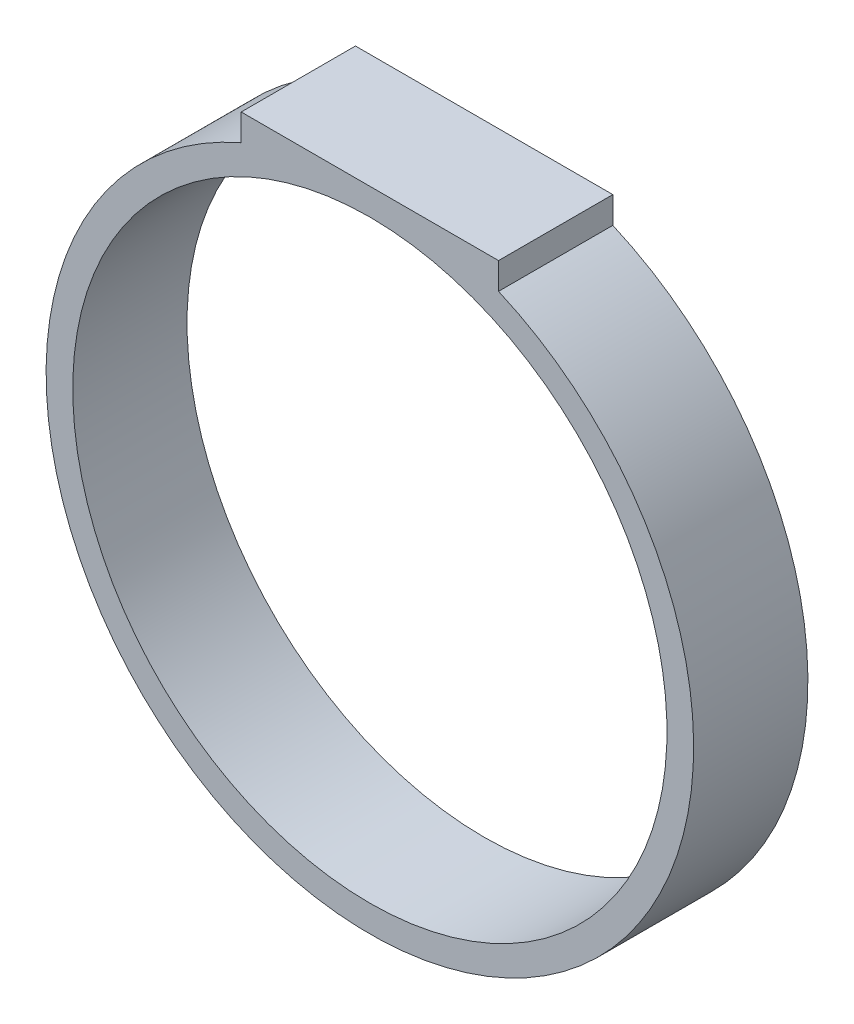
ISO-10303-21;
HEADER;
FILE_DESCRIPTION(('STEP AP214'),'2;1');
FILE_NAME('part.step','',(''),(''),'','','');
FILE_SCHEMA(('AUTOMOTIVE_DESIGN { 1 0 10303 214 1 1 1 1 }'));
ENDSEC;
DATA;
#1=APPLICATION_CONTEXT('core data for automotive mechanical design processes');
#2=APPLICATION_PROTOCOL_DEFINITION('international standard','automotive_design',2000,#1);
#3=PRODUCT_CONTEXT('',#1,'mechanical');
#4=PRODUCT('Part','Part','',(#3));
#5=PRODUCT_RELATED_PRODUCT_CATEGORY('part','',(#4));
#6=PRODUCT_DEFINITION_FORMATION('','',#4);
#7=PRODUCT_DEFINITION_CONTEXT('part definition',#1,'design');
#8=PRODUCT_DEFINITION('design','',#6,#7);
#9=PRODUCT_DEFINITION_SHAPE('','',#8);
#10=(LENGTH_UNIT() NAMED_UNIT(*) SI_UNIT(.MILLI.,.METRE.));
#11=(NAMED_UNIT(*) PLANE_ANGLE_UNIT() SI_UNIT($,.RADIAN.));
#12=(NAMED_UNIT(*) SI_UNIT($,.STERADIAN.) SOLID_ANGLE_UNIT());
#13=UNCERTAINTY_MEASURE_WITH_UNIT(LENGTH_MEASURE(1.E-05),#10,'distance_accuracy_value','');
#14=(GEOMETRIC_REPRESENTATION_CONTEXT(3) GLOBAL_UNCERTAINTY_ASSIGNED_CONTEXT((#13)) GLOBAL_UNIT_ASSIGNED_CONTEXT((#10,
#11,#12)) REPRESENTATION_CONTEXT('',''));
#15=CARTESIAN_POINT('',(0.,0.,0.));
#16=DIRECTION('',(0.,0.,1.));
#17=DIRECTION('',(1.,0.,0.));
#18=AXIS2_PLACEMENT_3D('',#15,#16,#17);
#19=CARTESIAN_POINT('',(0.,0.,15.));
#20=DIRECTION('',(0.,0.,1.));
#21=DIRECTION('',(1.,0.,0.));
#22=AXIS2_PLACEMENT_3D('',#19,#20,#21);
#23=PLANE('',#22);
#24=CARTESIAN_POINT('',(0.,0.,15.));
#25=DIRECTION('',(0.,0.,1.));
#26=DIRECTION('',(1.,0.,0.));
#27=AXIS2_PLACEMENT_3D('',#24,#25,#26);
#28=CIRCLE('',#27,78.);
#29=CARTESIAN_POINT('',(-0.29732137493872,77.9994333312749,15.));
#30=VERTEX_POINT('',#29);
#31=CARTESIAN_POINT('',(0.29732137493872,77.9994333312749,15.));
#32=VERTEX_POINT('',#31);
#33=EDGE_CURVE('E129',#30,#32,#28,.T.);
#34=ORIENTED_EDGE('',*,*,#33,.F.);
#35=DIRECTION('',(1.,0.,0.));
#36=VECTOR('',#35,1.);
#37=CARTESIAN_POINT('',(33.78,77.9994333312749,15.));
#38=LINE('',#37,#36);
#39=EDGE_CURVE('E127',#32,#30,#38,.F.);
#40=ORIENTED_EDGE('',*,*,#39,.F.);
#41=EDGE_LOOP('',(#34,#40));
#42=FACE_BOUND('',#41,.T.);
#43=DIRECTION('',(0.,-1.,0.));
#44=VECTOR('',#43,1.);
#45=CARTESIAN_POINT('',(-33.78,77.9994333312749,15.));
#46=LINE('',#45,#44);
#47=CARTESIAN_POINT('',(-33.78,85.,15.));
#48=VERTEX_POINT('',#47);
#49=CARTESIAN_POINT('',(-33.78,77.9994333312749,15.));
#50=VERTEX_POINT('',#49);
#51=EDGE_CURVE('E109',#48,#50,#46,.T.);
#52=ORIENTED_EDGE('',*,*,#51,.T.);
#53=CARTESIAN_POINT('',(0.,0.,15.));
#54=DIRECTION('',(0.,0.,1.));
#55=DIRECTION('',(1.,0.,0.));
#56=AXIS2_PLACEMENT_3D('',#53,#54,#55);
#57=CIRCLE('',#56,85.);
#58=CARTESIAN_POINT('',(33.78,77.9994333312749,15.));
#59=VERTEX_POINT('',#58);
#60=EDGE_CURVE('E122',#50,#59,#57,.T.);
#61=ORIENTED_EDGE('',*,*,#60,.T.);
#62=DIRECTION('',(0.,1.,0.));
#63=VECTOR('',#62,1.);
#64=CARTESIAN_POINT('',(33.78,77.9994333312749,15.));
#65=LINE('',#64,#63);
#66=CARTESIAN_POINT('',(33.78,85.,15.));
#67=VERTEX_POINT('',#66);
#68=EDGE_CURVE('E115',#59,#67,#65,.T.);
#69=ORIENTED_EDGE('',*,*,#68,.T.);
#70=DIRECTION('',(-1.,0.,0.));
#71=VECTOR('',#70,1.);
#72=CARTESIAN_POINT('',(-33.78,85.,15.));
#73=LINE('',#72,#71);
#74=EDGE_CURVE('E91',#67,#48,#73,.T.);
#75=ORIENTED_EDGE('',*,*,#74,.T.);
#76=EDGE_LOOP('',(#52,#61,#69,#75));
#77=FACE_BOUND('',#76,.T.);
#78=ADVANCED_FACE('F33',(#42,#77),#23,.T.);
#79=CARTESIAN_POINT('',(0.,0.,-15.));
#80=DIRECTION('',(0.,0.,1.));
#81=DIRECTION('',(1.,0.,0.));
#82=AXIS2_PLACEMENT_3D('',#79,#80,#81);
#83=PLANE('',#82);
#84=DIRECTION('',(1.,0.,0.));
#85=VECTOR('',#84,1.);
#86=CARTESIAN_POINT('',(33.78,77.9994333312749,-15.));
#87=LINE('',#86,#85);
#88=CARTESIAN_POINT('',(0.29732137493872,77.9994333312749,-15.));
#89=VERTEX_POINT('',#88);
#90=CARTESIAN_POINT('',(-0.29732137493872,77.9994333312749,-15.));
#91=VERTEX_POINT('',#90);
#92=EDGE_CURVE('E37',#89,#91,#87,.F.);
#93=ORIENTED_EDGE('',*,*,#92,.T.);
#94=CARTESIAN_POINT('',(0.,0.,-15.));
#95=DIRECTION('',(0.,0.,1.));
#96=DIRECTION('',(1.,0.,0.));
#97=AXIS2_PLACEMENT_3D('',#94,#95,#96);
#98=CIRCLE('',#97,78.);
#99=EDGE_CURVE('E50',#91,#89,#98,.T.);
#100=ORIENTED_EDGE('',*,*,#99,.T.);
#101=EDGE_LOOP('',(#93,#100));
#102=FACE_BOUND('',#101,.T.);
#103=CARTESIAN_POINT('',(0.,0.,-15.));
#104=DIRECTION('',(0.,0.,1.));
#105=DIRECTION('',(1.,0.,0.));
#106=AXIS2_PLACEMENT_3D('',#103,#104,#105);
#107=CIRCLE('',#106,85.);
#108=CARTESIAN_POINT('',(-33.78,77.9994333312749,-15.));
#109=VERTEX_POINT('',#108);
#110=CARTESIAN_POINT('',(33.78,77.9994333312749,-15.));
#111=VERTEX_POINT('',#110);
#112=EDGE_CURVE('E125',#109,#111,#107,.T.);
#113=ORIENTED_EDGE('',*,*,#112,.F.);
#114=DIRECTION('',(0.,-1.,0.));
#115=VECTOR('',#114,1.);
#116=CARTESIAN_POINT('',(-33.78,77.9994333312749,-15.));
#117=LINE('',#116,#115);
#118=CARTESIAN_POINT('',(-33.78,85.,-15.));
#119=VERTEX_POINT('',#118);
#120=EDGE_CURVE('E96',#119,#109,#117,.T.);
#121=ORIENTED_EDGE('',*,*,#120,.F.);
#122=DIRECTION('',(-1.,0.,0.));
#123=VECTOR('',#122,1.);
#124=CARTESIAN_POINT('',(-33.78,85.,-15.));
#125=LINE('',#124,#123);
#126=CARTESIAN_POINT('',(33.78,85.,-15.));
#127=VERTEX_POINT('',#126);
#128=EDGE_CURVE('E89',#127,#119,#125,.T.);
#129=ORIENTED_EDGE('',*,*,#128,.F.);
#130=DIRECTION('',(0.,1.,0.));
#131=VECTOR('',#130,1.);
#132=CARTESIAN_POINT('',(33.78,77.9994333312749,-15.));
#133=LINE('',#132,#131);
#134=EDGE_CURVE('E103',#111,#127,#133,.T.);
#135=ORIENTED_EDGE('',*,*,#134,.F.);
#136=EDGE_LOOP('',(#113,#121,#129,#135));
#137=FACE_BOUND('',#136,.T.);
#138=ADVANCED_FACE('F102',(#102,#137),#83,.F.);
#139=CARTESIAN_POINT('',(0.,0.,15.));
#140=DIRECTION('',(0.,0.,-1.));
#141=DIRECTION('',(-1.,0.,0.));
#142=AXIS2_PLACEMENT_3D('',#139,#140,#141);
#143=CYLINDRICAL_SURFACE('',#142,85.);
#144=ORIENTED_EDGE('',*,*,#112,.T.);
#145=DIRECTION('',(0.,0.,1.));
#146=VECTOR('',#145,1.);
#147=CARTESIAN_POINT('',(33.78,77.9994333312749,-15.));
#148=LINE('',#147,#146);
#149=EDGE_CURVE('E108',#111,#59,#148,.T.);
#150=ORIENTED_EDGE('',*,*,#149,.T.);
#151=ORIENTED_EDGE('',*,*,#60,.F.);
#152=DIRECTION('',(0.,0.,1.));
#153=VECTOR('',#152,1.);
#154=CARTESIAN_POINT('',(-33.78,77.9994333312749,-15.));
#155=LINE('',#154,#153);
#156=EDGE_CURVE('E119',#109,#50,#155,.T.);
#157=ORIENTED_EDGE('',*,*,#156,.F.);
#158=EDGE_LOOP('',(#144,#150,#151,#157));
#159=FACE_BOUND('',#158,.T.);
#160=ADVANCED_FACE('F35',(#159),#143,.T.);
#161=CARTESIAN_POINT('',(0.,0.,15.));
#162=DIRECTION('',(0.,0.,-1.));
#163=DIRECTION('',(-1.,0.,0.));
#164=AXIS2_PLACEMENT_3D('',#161,#162,#163);
#165=CYLINDRICAL_SURFACE('',#164,78.);
#166=DIRECTION('',(0.,0.,-1.));
#167=VECTOR('',#166,1.);
#168=CARTESIAN_POINT('',(-0.297321374938719,77.9994333312749,15.));
#169=LINE('',#168,#167);
#170=EDGE_CURVE('E11',#30,#91,#169,.T.);
#171=ORIENTED_EDGE('',*,*,#170,.F.);
#172=ORIENTED_EDGE('',*,*,#33,.T.);
#173=DIRECTION('',(0.,0.,-1.));
#174=VECTOR('',#173,1.);
#175=CARTESIAN_POINT('',(0.297321374938719,77.9994333312749,15.));
#176=LINE('',#175,#174);
#177=EDGE_CURVE('E42',#89,#32,#176,.F.);
#178=ORIENTED_EDGE('',*,*,#177,.F.);
#179=ORIENTED_EDGE('',*,*,#99,.F.);
#180=EDGE_LOOP('',(#171,#172,#178,#179));
#181=FACE_BOUND('',#180,.T.);
#182=ADVANCED_FACE('F138',(#181),#165,.F.);
#183=CARTESIAN_POINT('',(33.78,77.9994333312749,-15.));
#184=DIRECTION('',(0.,-1.,0.));
#185=DIRECTION('',(0.,0.,-1.));
#186=AXIS2_PLACEMENT_3D('',#183,#184,#185);
#187=PLANE('',#186);
#188=ORIENTED_EDGE('',*,*,#39,.T.);
#189=ORIENTED_EDGE('',*,*,#170,.T.);
#190=ORIENTED_EDGE('',*,*,#92,.F.);
#191=ORIENTED_EDGE('',*,*,#177,.T.);
#192=EDGE_LOOP('',(#188,#189,#190,#191));
#193=FACE_BOUND('',#192,.T.);
#194=ADVANCED_FACE('F134',(#193),#187,.T.);
#195=CARTESIAN_POINT('',(-33.78,85.,-15.));
#196=DIRECTION('',(0.,1.,0.));
#197=DIRECTION('',(0.,0.,1.));
#198=AXIS2_PLACEMENT_3D('',#195,#196,#197);
#199=PLANE('',#198);
#200=ORIENTED_EDGE('',*,*,#128,.T.);
#201=DIRECTION('',(0.,0.,1.));
#202=VECTOR('',#201,1.);
#203=CARTESIAN_POINT('',(-33.78,85.,-15.));
#204=LINE('',#203,#202);
#205=EDGE_CURVE('E95',#119,#48,#204,.T.);
#206=ORIENTED_EDGE('',*,*,#205,.T.);
#207=ORIENTED_EDGE('',*,*,#74,.F.);
#208=DIRECTION('',(0.,0.,1.));
#209=VECTOR('',#208,1.);
#210=CARTESIAN_POINT('',(33.78,85.,-15.));
#211=LINE('',#210,#209);
#212=EDGE_CURVE('E85',#127,#67,#211,.T.);
#213=ORIENTED_EDGE('',*,*,#212,.F.);
#214=EDGE_LOOP('',(#200,#206,#207,#213));
#215=FACE_BOUND('',#214,.T.);
#216=ADVANCED_FACE('F87',(#215),#199,.T.);
#217=CARTESIAN_POINT('',(33.78,77.9994333312749,-15.));
#218=DIRECTION('',(1.,0.,0.));
#219=DIRECTION('',(0.,0.,-1.));
#220=AXIS2_PLACEMENT_3D('',#217,#218,#219);
#221=PLANE('',#220);
#222=ORIENTED_EDGE('',*,*,#68,.F.);
#223=ORIENTED_EDGE('',*,*,#149,.F.);
#224=ORIENTED_EDGE('',*,*,#134,.T.);
#225=ORIENTED_EDGE('',*,*,#212,.T.);
#226=EDGE_LOOP('',(#222,#223,#224,#225));
#227=FACE_BOUND('',#226,.T.);
#228=ADVANCED_FACE('F106',(#227),#221,.T.);
#229=CARTESIAN_POINT('',(-33.78,77.9994333312749,-15.));
#230=DIRECTION('',(-1.,0.,0.));
#231=DIRECTION('',(0.,0.,1.));
#232=AXIS2_PLACEMENT_3D('',#229,#230,#231);
#233=PLANE('',#232);
#234=ORIENTED_EDGE('',*,*,#51,.F.);
#235=ORIENTED_EDGE('',*,*,#205,.F.);
#236=ORIENTED_EDGE('',*,*,#120,.T.);
#237=ORIENTED_EDGE('',*,*,#156,.T.);
#238=EDGE_LOOP('',(#234,#235,#236,#237));
#239=FACE_BOUND('',#238,.T.);
#240=ADVANCED_FACE('F172',(#239),#233,.T.);
#241=CLOSED_SHELL('',(#78,#138,#160,#182,#194,#216,#228,#240));
#242=MANIFOLD_SOLID_BREP('B2',#241);
#243=ADVANCED_BREP_SHAPE_REPRESENTATION('',(#18,#242),#14);
#244=SHAPE_DEFINITION_REPRESENTATION(#9,#243);
ENDSEC;
END-ISO-10303-21;
